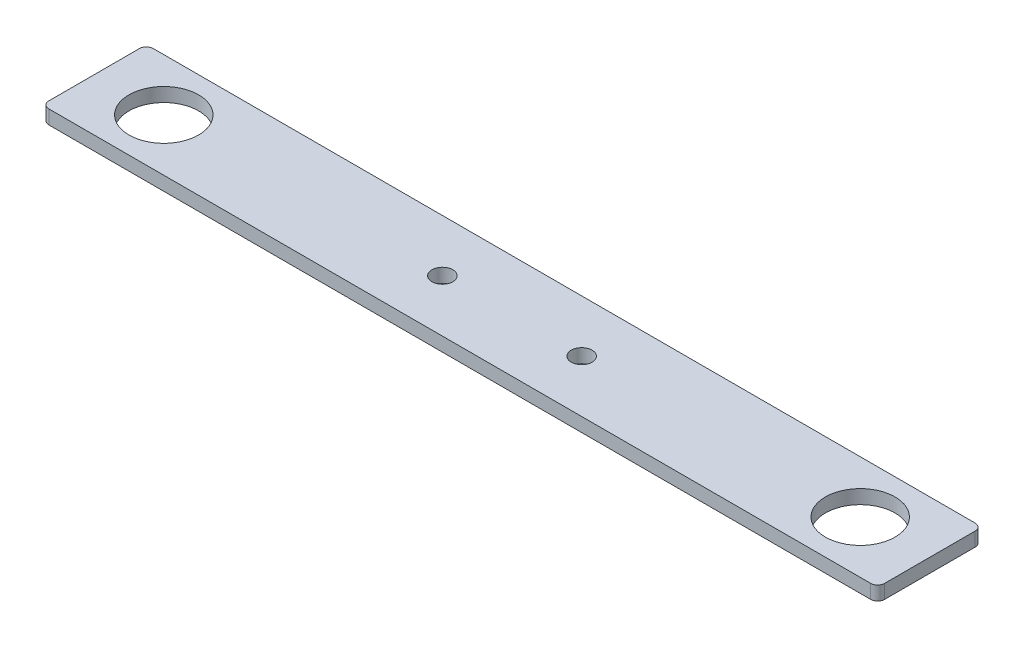
ISO-10303-21;
HEADER;
FILE_DESCRIPTION(('STEP AP214'),'2;1');
FILE_NAME('part.step','',(''),(''),'','','');
FILE_SCHEMA(('AUTOMOTIVE_DESIGN { 1 0 10303 214 1 1 1 1 }'));
ENDSEC;
DATA;
#1=APPLICATION_CONTEXT('core data for automotive mechanical design processes');
#2=APPLICATION_PROTOCOL_DEFINITION('international standard','automotive_design',2000,#1);
#3=PRODUCT_CONTEXT('',#1,'mechanical');
#4=PRODUCT('Part','Part','',(#3));
#5=PRODUCT_RELATED_PRODUCT_CATEGORY('part','',(#4));
#6=PRODUCT_DEFINITION_FORMATION('','',#4);
#7=PRODUCT_DEFINITION_CONTEXT('part definition',#1,'design');
#8=PRODUCT_DEFINITION('design','',#6,#7);
#9=PRODUCT_DEFINITION_SHAPE('','',#8);
#10=(LENGTH_UNIT() NAMED_UNIT(*) SI_UNIT(.MILLI.,.METRE.));
#11=(NAMED_UNIT(*) PLANE_ANGLE_UNIT() SI_UNIT($,.RADIAN.));
#12=(NAMED_UNIT(*) SI_UNIT($,.STERADIAN.) SOLID_ANGLE_UNIT());
#13=UNCERTAINTY_MEASURE_WITH_UNIT(LENGTH_MEASURE(1.E-05),#10,'distance_accuracy_value','');
#14=(GEOMETRIC_REPRESENTATION_CONTEXT(3) GLOBAL_UNCERTAINTY_ASSIGNED_CONTEXT((#13)) GLOBAL_UNIT_ASSIGNED_CONTEXT((#10,
#11,#12)) REPRESENTATION_CONTEXT('',''));
#15=CARTESIAN_POINT('',(0.,0.,0.));
#16=DIRECTION('',(0.,0.,1.));
#17=DIRECTION('',(1.,0.,0.));
#18=AXIS2_PLACEMENT_3D('',#15,#16,#17);
#19=CARTESIAN_POINT('',(120.,2.,0.));
#20=DIRECTION('',(-1.,0.,0.));
#21=DIRECTION('',(0.,0.,1.));
#22=AXIS2_PLACEMENT_3D('',#19,#20,#21);
#23=PLANE('',#22);
#24=DIRECTION('',(0.,0.,-1.));
#25=VECTOR('',#24,1.);
#26=CARTESIAN_POINT('',(120.,0.,0.));
#27=LINE('',#26,#25);
#28=CARTESIAN_POINT('',(120.,0.,-1.));
#29=VERTEX_POINT('',#28);
#30=CARTESIAN_POINT('',(120.,0.,-14.));
#31=VERTEX_POINT('',#30);
#32=EDGE_CURVE('E123',#29,#31,#27,.T.);
#33=ORIENTED_EDGE('',*,*,#32,.T.);
#34=DIRECTION('',(0.,-1.,0.));
#35=VECTOR('',#34,1.);
#36=CARTESIAN_POINT('',(120.,2.,-14.));
#37=LINE('',#36,#35);
#38=CARTESIAN_POINT('',(120.,2.,-14.));
#39=VERTEX_POINT('',#38);
#40=EDGE_CURVE('E145',#31,#39,#37,.F.);
#41=ORIENTED_EDGE('',*,*,#40,.T.);
#42=DIRECTION('',(0.,0.,-1.));
#43=VECTOR('',#42,1.);
#44=CARTESIAN_POINT('',(120.,2.,0.));
#45=LINE('',#44,#43);
#46=CARTESIAN_POINT('',(120.,2.,-1.));
#47=VERTEX_POINT('',#46);
#48=EDGE_CURVE('E189',#47,#39,#45,.T.);
#49=ORIENTED_EDGE('',*,*,#48,.F.);
#50=DIRECTION('',(0.,-1.,0.));
#51=VECTOR('',#50,1.);
#52=CARTESIAN_POINT('',(120.,2.,-1.));
#53=LINE('',#52,#51);
#54=EDGE_CURVE('E142',#47,#29,#53,.T.);
#55=ORIENTED_EDGE('',*,*,#54,.T.);
#56=EDGE_LOOP('',(#33,#41,#49,#55));
#57=FACE_BOUND('',#56,.T.);
#58=ADVANCED_FACE('F35',(#57),#23,.F.);
#59=CARTESIAN_POINT('',(0.,2.,-15.));
#60=DIRECTION('',(0.,0.,-1.));
#61=DIRECTION('',(-1.,0.,0.));
#62=AXIS2_PLACEMENT_3D('',#59,#60,#61);
#63=PLANE('',#62);
#64=DIRECTION('',(1.,0.,0.));
#65=VECTOR('',#64,1.);
#66=CARTESIAN_POINT('',(0.,2.,-15.));
#67=LINE('',#66,#65);
#68=CARTESIAN_POINT('',(1.,2.,-15.));
#69=VERTEX_POINT('',#68);
#70=CARTESIAN_POINT('',(119.,2.,-15.));
#71=VERTEX_POINT('',#70);
#72=EDGE_CURVE('E165',#69,#71,#67,.T.);
#73=ORIENTED_EDGE('',*,*,#72,.T.);
#74=DIRECTION('',(0.,-1.,0.));
#75=VECTOR('',#74,1.);
#76=CARTESIAN_POINT('',(119.,0.,-15.));
#77=LINE('',#76,#75);
#78=CARTESIAN_POINT('',(119.,0.,-15.));
#79=VERTEX_POINT('',#78);
#80=EDGE_CURVE('E122',#71,#79,#77,.T.);
#81=ORIENTED_EDGE('',*,*,#80,.T.);
#82=DIRECTION('',(1.,0.,0.));
#83=VECTOR('',#82,1.);
#84=CARTESIAN_POINT('',(0.,0.,-15.));
#85=LINE('',#84,#83);
#86=CARTESIAN_POINT('',(1.,0.,-15.));
#87=VERTEX_POINT('',#86);
#88=EDGE_CURVE('E106',#87,#79,#85,.T.);
#89=ORIENTED_EDGE('',*,*,#88,.F.);
#90=DIRECTION('',(0.,-1.,0.));
#91=VECTOR('',#90,1.);
#92=CARTESIAN_POINT('',(1.,2.,-15.));
#93=LINE('',#92,#91);
#94=EDGE_CURVE('E119',#87,#69,#93,.F.);
#95=ORIENTED_EDGE('',*,*,#94,.T.);
#96=EDGE_LOOP('',(#73,#81,#89,#95));
#97=FACE_BOUND('',#96,.T.);
#98=ADVANCED_FACE('F118',(#97),#63,.T.);
#99=CARTESIAN_POINT('',(0.,2.,0.));
#100=DIRECTION('',(-1.,0.,0.));
#101=DIRECTION('',(0.,0.,1.));
#102=AXIS2_PLACEMENT_3D('',#99,#100,#101);
#103=PLANE('',#102);
#104=DIRECTION('',(0.,0.,-1.));
#105=VECTOR('',#104,1.);
#106=CARTESIAN_POINT('',(0.,2.,0.));
#107=LINE('',#106,#105);
#108=CARTESIAN_POINT('',(0.,2.,-1.));
#109=VERTEX_POINT('',#108);
#110=CARTESIAN_POINT('',(0.,2.,-14.));
#111=VERTEX_POINT('',#110);
#112=EDGE_CURVE('E160',#109,#111,#107,.T.);
#113=ORIENTED_EDGE('',*,*,#112,.T.);
#114=DIRECTION('',(0.,-1.,0.));
#115=VECTOR('',#114,1.);
#116=CARTESIAN_POINT('',(0.,2.,-14.));
#117=LINE('',#116,#115);
#118=CARTESIAN_POINT('',(0.,0.,-14.));
#119=VERTEX_POINT('',#118);
#120=EDGE_CURVE('E11',#111,#119,#117,.T.);
#121=ORIENTED_EDGE('',*,*,#120,.T.);
#122=DIRECTION('',(0.,0.,-1.));
#123=VECTOR('',#122,1.);
#124=CARTESIAN_POINT('',(0.,0.,0.));
#125=LINE('',#124,#123);
#126=CARTESIAN_POINT('',(0.,0.,-1.));
#127=VERTEX_POINT('',#126);
#128=EDGE_CURVE('E108',#127,#119,#125,.T.);
#129=ORIENTED_EDGE('',*,*,#128,.F.);
#130=DIRECTION('',(0.,-1.,0.));
#131=VECTOR('',#130,1.);
#132=CARTESIAN_POINT('',(0.,2.,-1.));
#133=LINE('',#132,#131);
#134=EDGE_CURVE('E43',#127,#109,#133,.F.);
#135=ORIENTED_EDGE('',*,*,#134,.T.);
#136=EDGE_LOOP('',(#113,#121,#129,#135));
#137=FACE_BOUND('',#136,.T.);
#138=ADVANCED_FACE('F159',(#137),#103,.T.);
#139=CARTESIAN_POINT('',(0.,2.,0.));
#140=DIRECTION('',(0.,0.,-1.));
#141=DIRECTION('',(-1.,0.,0.));
#142=AXIS2_PLACEMENT_3D('',#139,#140,#141);
#143=PLANE('',#142);
#144=DIRECTION('',(1.,0.,0.));
#145=VECTOR('',#144,1.);
#146=CARTESIAN_POINT('',(0.,0.,0.));
#147=LINE('',#146,#145);
#148=CARTESIAN_POINT('',(1.,0.,0.));
#149=VERTEX_POINT('',#148);
#150=CARTESIAN_POINT('',(119.,0.,0.));
#151=VERTEX_POINT('',#150);
#152=EDGE_CURVE('E170',#149,#151,#147,.T.);
#153=ORIENTED_EDGE('',*,*,#152,.T.);
#154=DIRECTION('',(0.,-1.,0.));
#155=VECTOR('',#154,1.);
#156=CARTESIAN_POINT('',(119.,2.,0.));
#157=LINE('',#156,#155);
#158=CARTESIAN_POINT('',(119.,2.,0.));
#159=VERTEX_POINT('',#158);
#160=EDGE_CURVE('E50',#151,#159,#157,.F.);
#161=ORIENTED_EDGE('',*,*,#160,.T.);
#162=DIRECTION('',(1.,0.,0.));
#163=VECTOR('',#162,1.);
#164=CARTESIAN_POINT('',(0.,2.,0.));
#165=LINE('',#164,#163);
#166=CARTESIAN_POINT('',(1.,2.,0.));
#167=VERTEX_POINT('',#166);
#168=EDGE_CURVE('E132',#167,#159,#165,.T.);
#169=ORIENTED_EDGE('',*,*,#168,.F.);
#170=DIRECTION('',(0.,-1.,0.));
#171=VECTOR('',#170,1.);
#172=CARTESIAN_POINT('',(1.,0.,0.));
#173=LINE('',#172,#171);
#174=EDGE_CURVE('E153',#167,#149,#173,.T.);
#175=ORIENTED_EDGE('',*,*,#174,.T.);
#176=EDGE_LOOP('',(#153,#161,#169,#175));
#177=FACE_BOUND('',#176,.T.);
#178=ADVANCED_FACE('F169',(#177),#143,.F.);
#179=CARTESIAN_POINT('',(10.,2.,-7.5));
#180=DIRECTION('',(0.,-1.,0.));
#181=DIRECTION('',(0.,0.,-1.));
#182=AXIS2_PLACEMENT_3D('',#179,#180,#181);
#183=CYLINDRICAL_SURFACE('',#182,5.);
#184=CARTESIAN_POINT('',(10.,2.,-7.5));
#185=DIRECTION('',(0.,1.,0.));
#186=DIRECTION('',(0.,0.,1.));
#187=AXIS2_PLACEMENT_3D('',#184,#185,#186);
#188=CIRCLE('',#187,5.);
#189=CARTESIAN_POINT('',(10.,2.,-2.5));
#190=VERTEX_POINT('',#189);
#191=EDGE_CURVE('E191',#190,#190,#188,.T.);
#192=ORIENTED_EDGE('',*,*,#191,.T.);
#193=EDGE_LOOP('',(#192));
#194=FACE_BOUND('',#193,.T.);
#195=CARTESIAN_POINT('',(10.,0.,-7.5));
#196=DIRECTION('',(0.,1.,0.));
#197=DIRECTION('',(0.,0.,1.));
#198=AXIS2_PLACEMENT_3D('',#195,#196,#197);
#199=CIRCLE('',#198,5.);
#200=CARTESIAN_POINT('',(10.,0.,-2.5));
#201=VERTEX_POINT('',#200);
#202=EDGE_CURVE('E178',#201,#201,#199,.T.);
#203=ORIENTED_EDGE('',*,*,#202,.F.);
#204=EDGE_LOOP('',(#203));
#205=FACE_BOUND('',#204,.T.);
#206=ADVANCED_FACE('F211',(#194,#205),#183,.F.);
#207=CARTESIAN_POINT('',(50.,2.,-7.5));
#208=DIRECTION('',(0.,-1.,0.));
#209=DIRECTION('',(0.,0.,-1.));
#210=AXIS2_PLACEMENT_3D('',#207,#208,#209);
#211=CYLINDRICAL_SURFACE('',#210,1.5);
#212=CARTESIAN_POINT('',(50.,2.,-7.5));
#213=DIRECTION('',(0.,1.,0.));
#214=DIRECTION('',(0.,0.,1.));
#215=AXIS2_PLACEMENT_3D('',#212,#213,#214);
#216=CIRCLE('',#215,1.5);
#217=CARTESIAN_POINT('',(50.,2.,-6.));
#218=VERTEX_POINT('',#217);
#219=EDGE_CURVE('E194',#218,#218,#216,.T.);
#220=ORIENTED_EDGE('',*,*,#219,.T.);
#221=EDGE_LOOP('',(#220));
#222=FACE_BOUND('',#221,.T.);
#223=CARTESIAN_POINT('',(50.,0.,-7.5));
#224=DIRECTION('',(0.,1.,0.));
#225=DIRECTION('',(0.,0.,1.));
#226=AXIS2_PLACEMENT_3D('',#223,#224,#225);
#227=CIRCLE('',#226,1.5);
#228=CARTESIAN_POINT('',(50.,0.,-6.));
#229=VERTEX_POINT('',#228);
#230=EDGE_CURVE('E181',#229,#229,#227,.T.);
#231=ORIENTED_EDGE('',*,*,#230,.F.);
#232=EDGE_LOOP('',(#231));
#233=FACE_BOUND('',#232,.T.);
#234=ADVANCED_FACE('F214',(#222,#233),#211,.F.);
#235=CARTESIAN_POINT('',(70.,2.,-7.5));
#236=DIRECTION('',(0.,-1.,0.));
#237=DIRECTION('',(0.,0.,-1.));
#238=AXIS2_PLACEMENT_3D('',#235,#236,#237);
#239=CYLINDRICAL_SURFACE('',#238,1.5);
#240=CARTESIAN_POINT('',(70.,2.,-7.5));
#241=DIRECTION('',(0.,1.,0.));
#242=DIRECTION('',(0.,0.,1.));
#243=AXIS2_PLACEMENT_3D('',#240,#241,#242);
#244=CIRCLE('',#243,1.5);
#245=CARTESIAN_POINT('',(70.,2.,-6.));
#246=VERTEX_POINT('',#245);
#247=EDGE_CURVE('E173',#246,#246,#244,.T.);
#248=ORIENTED_EDGE('',*,*,#247,.T.);
#249=EDGE_LOOP('',(#248));
#250=FACE_BOUND('',#249,.T.);
#251=CARTESIAN_POINT('',(70.,0.,-7.5));
#252=DIRECTION('',(0.,1.,0.));
#253=DIRECTION('',(0.,0.,1.));
#254=AXIS2_PLACEMENT_3D('',#251,#252,#253);
#255=CIRCLE('',#254,1.5);
#256=CARTESIAN_POINT('',(70.,0.,-6.));
#257=VERTEX_POINT('',#256);
#258=EDGE_CURVE('E184',#257,#257,#255,.T.);
#259=ORIENTED_EDGE('',*,*,#258,.F.);
#260=EDGE_LOOP('',(#259));
#261=FACE_BOUND('',#260,.T.);
#262=ADVANCED_FACE('F200',(#250,#261),#239,.F.);
#263=CARTESIAN_POINT('',(110.,2.,-7.5));
#264=DIRECTION('',(0.,-1.,0.));
#265=DIRECTION('',(0.,0.,-1.));
#266=AXIS2_PLACEMENT_3D('',#263,#264,#265);
#267=CYLINDRICAL_SURFACE('',#266,5.);
#268=CARTESIAN_POINT('',(110.,2.,-7.5));
#269=DIRECTION('',(0.,1.,0.));
#270=DIRECTION('',(0.,0.,1.));
#271=AXIS2_PLACEMENT_3D('',#268,#269,#270);
#272=CIRCLE('',#271,5.);
#273=CARTESIAN_POINT('',(110.,2.,-2.5));
#274=VERTEX_POINT('',#273);
#275=EDGE_CURVE('E128',#274,#274,#272,.T.);
#276=ORIENTED_EDGE('',*,*,#275,.T.);
#277=EDGE_LOOP('',(#276));
#278=FACE_BOUND('',#277,.T.);
#279=CARTESIAN_POINT('',(110.,0.,-7.5));
#280=DIRECTION('',(0.,1.,0.));
#281=DIRECTION('',(0.,0.,1.));
#282=AXIS2_PLACEMENT_3D('',#279,#280,#281);
#283=CIRCLE('',#282,5.);
#284=CARTESIAN_POINT('',(110.,0.,-2.5));
#285=VERTEX_POINT('',#284);
#286=EDGE_CURVE('E135',#285,#285,#283,.T.);
#287=ORIENTED_EDGE('',*,*,#286,.F.);
#288=EDGE_LOOP('',(#287));
#289=FACE_BOUND('',#288,.T.);
#290=ADVANCED_FACE('F205',(#278,#289),#267,.F.);
#291=CARTESIAN_POINT('',(0.,2.,0.));
#292=DIRECTION('',(0.,1.,0.));
#293=DIRECTION('',(0.,0.,1.));
#294=AXIS2_PLACEMENT_3D('',#291,#292,#293);
#295=PLANE('',#294);
#296=ORIENTED_EDGE('',*,*,#247,.F.);
#297=EDGE_LOOP('',(#296));
#298=FACE_BOUND('',#297,.T.);
#299=ORIENTED_EDGE('',*,*,#219,.F.);
#300=EDGE_LOOP('',(#299));
#301=FACE_BOUND('',#300,.T.);
#302=ORIENTED_EDGE('',*,*,#191,.F.);
#303=EDGE_LOOP('',(#302));
#304=FACE_BOUND('',#303,.T.);
#305=ORIENTED_EDGE('',*,*,#48,.T.);
#306=CARTESIAN_POINT('',(119.,2.,-14.));
#307=DIRECTION('',(0.,1.,0.));
#308=DIRECTION('',(0.,0.,1.));
#309=AXIS2_PLACEMENT_3D('',#306,#307,#308);
#310=CIRCLE('',#309,1.);
#311=EDGE_CURVE('E151',#39,#71,#310,.T.);
#312=ORIENTED_EDGE('',*,*,#311,.T.);
#313=ORIENTED_EDGE('',*,*,#72,.F.);
#314=CARTESIAN_POINT('',(1.,2.,-14.));
#315=DIRECTION('',(0.,1.,0.));
#316=DIRECTION('',(0.,0.,1.));
#317=AXIS2_PLACEMENT_3D('',#314,#315,#316);
#318=CIRCLE('',#317,1.);
#319=EDGE_CURVE('E127',#69,#111,#318,.T.);
#320=ORIENTED_EDGE('',*,*,#319,.T.);
#321=ORIENTED_EDGE('',*,*,#112,.F.);
#322=CARTESIAN_POINT('',(1.,2.,-1.));
#323=DIRECTION('',(0.,1.,0.));
#324=DIRECTION('',(0.,0.,1.));
#325=AXIS2_PLACEMENT_3D('',#322,#323,#324);
#326=CIRCLE('',#325,1.);
#327=EDGE_CURVE('E57',#109,#167,#326,.T.);
#328=ORIENTED_EDGE('',*,*,#327,.T.);
#329=ORIENTED_EDGE('',*,*,#168,.T.);
#330=CARTESIAN_POINT('',(119.,2.,-1.));
#331=DIRECTION('',(0.,1.,0.));
#332=DIRECTION('',(0.,0.,1.));
#333=AXIS2_PLACEMENT_3D('',#330,#331,#332);
#334=CIRCLE('',#333,1.);
#335=EDGE_CURVE('E149',#159,#47,#334,.T.);
#336=ORIENTED_EDGE('',*,*,#335,.T.);
#337=EDGE_LOOP('',(#305,#312,#313,#320,#321,#328,#329,#336));
#338=FACE_BOUND('',#337,.T.);
#339=ORIENTED_EDGE('',*,*,#275,.F.);
#340=EDGE_LOOP('',(#339));
#341=FACE_BOUND('',#340,.T.);
#342=ADVANCED_FACE('F163',(#298,#301,#304,#338,#341),#295,.T.);
#343=CARTESIAN_POINT('',(0.,0.,0.));
#344=DIRECTION('',(0.,1.,0.));
#345=DIRECTION('',(0.,0.,1.));
#346=AXIS2_PLACEMENT_3D('',#343,#344,#345);
#347=PLANE('',#346);
#348=ORIENTED_EDGE('',*,*,#258,.T.);
#349=EDGE_LOOP('',(#348));
#350=FACE_BOUND('',#349,.T.);
#351=ORIENTED_EDGE('',*,*,#230,.T.);
#352=EDGE_LOOP('',(#351));
#353=FACE_BOUND('',#352,.T.);
#354=ORIENTED_EDGE('',*,*,#202,.T.);
#355=EDGE_LOOP('',(#354));
#356=FACE_BOUND('',#355,.T.);
#357=ORIENTED_EDGE('',*,*,#88,.T.);
#358=CARTESIAN_POINT('',(119.,0.,-14.));
#359=DIRECTION('',(0.,1.,0.));
#360=DIRECTION('',(0.,0.,1.));
#361=AXIS2_PLACEMENT_3D('',#358,#359,#360);
#362=CIRCLE('',#361,1.);
#363=EDGE_CURVE('E140',#79,#31,#362,.F.);
#364=ORIENTED_EDGE('',*,*,#363,.T.);
#365=ORIENTED_EDGE('',*,*,#32,.F.);
#366=CARTESIAN_POINT('',(119.,0.,-1.));
#367=DIRECTION('',(0.,1.,0.));
#368=DIRECTION('',(0.,0.,1.));
#369=AXIS2_PLACEMENT_3D('',#366,#367,#368);
#370=CIRCLE('',#369,1.);
#371=EDGE_CURVE('E112',#29,#151,#370,.F.);
#372=ORIENTED_EDGE('',*,*,#371,.T.);
#373=ORIENTED_EDGE('',*,*,#152,.F.);
#374=CARTESIAN_POINT('',(1.,0.,-1.));
#375=DIRECTION('',(0.,1.,0.));
#376=DIRECTION('',(0.,0.,1.));
#377=AXIS2_PLACEMENT_3D('',#374,#375,#376);
#378=CIRCLE('',#377,1.);
#379=EDGE_CURVE('E113',#149,#127,#378,.F.);
#380=ORIENTED_EDGE('',*,*,#379,.T.);
#381=ORIENTED_EDGE('',*,*,#128,.T.);
#382=CARTESIAN_POINT('',(1.,0.,-14.));
#383=DIRECTION('',(0.,1.,0.));
#384=DIRECTION('',(0.,0.,1.));
#385=AXIS2_PLACEMENT_3D('',#382,#383,#384);
#386=CIRCLE('',#385,1.);
#387=EDGE_CURVE('E102',#119,#87,#386,.F.);
#388=ORIENTED_EDGE('',*,*,#387,.T.);
#389=EDGE_LOOP('',(#357,#364,#365,#372,#373,#380,#381,#388));
#390=FACE_BOUND('',#389,.T.);
#391=ORIENTED_EDGE('',*,*,#286,.T.);
#392=EDGE_LOOP('',(#391));
#393=FACE_BOUND('',#392,.T.);
#394=ADVANCED_FACE('F104',(#350,#353,#356,#390,#393),#347,.F.);
#395=CARTESIAN_POINT('',(119.,2.,-14.));
#396=DIRECTION('',(0.,1.,0.));
#397=DIRECTION('',(0.,0.,1.));
#398=AXIS2_PLACEMENT_3D('',#395,#396,#397);
#399=CYLINDRICAL_SURFACE('',#398,1.);
#400=ORIENTED_EDGE('',*,*,#311,.F.);
#401=ORIENTED_EDGE('',*,*,#40,.F.);
#402=ORIENTED_EDGE('',*,*,#363,.F.);
#403=ORIENTED_EDGE('',*,*,#80,.F.);
#404=EDGE_LOOP('',(#400,#401,#402,#403));
#405=FACE_BOUND('',#404,.T.);
#406=ADVANCED_FACE('F219',(#405),#399,.T.);
#407=CARTESIAN_POINT('',(119.,2.,-1.));
#408=DIRECTION('',(0.,-1.,0.));
#409=DIRECTION('',(0.,0.,-1.));
#410=AXIS2_PLACEMENT_3D('',#407,#408,#409);
#411=CYLINDRICAL_SURFACE('',#410,1.);
#412=ORIENTED_EDGE('',*,*,#335,.F.);
#413=ORIENTED_EDGE('',*,*,#160,.F.);
#414=ORIENTED_EDGE('',*,*,#371,.F.);
#415=ORIENTED_EDGE('',*,*,#54,.F.);
#416=EDGE_LOOP('',(#412,#413,#414,#415));
#417=FACE_BOUND('',#416,.T.);
#418=ADVANCED_FACE('F226',(#417),#411,.T.);
#419=CARTESIAN_POINT('',(1.,2.,-14.));
#420=DIRECTION('',(0.,-1.,0.));
#421=DIRECTION('',(0.,0.,-1.));
#422=AXIS2_PLACEMENT_3D('',#419,#420,#421);
#423=CYLINDRICAL_SURFACE('',#422,1.);
#424=ORIENTED_EDGE('',*,*,#319,.F.);
#425=ORIENTED_EDGE('',*,*,#94,.F.);
#426=ORIENTED_EDGE('',*,*,#387,.F.);
#427=ORIENTED_EDGE('',*,*,#120,.F.);
#428=EDGE_LOOP('',(#424,#425,#426,#427));
#429=FACE_BOUND('',#428,.T.);
#430=ADVANCED_FACE('F126',(#429),#423,.T.);
#431=CARTESIAN_POINT('',(1.,2.,-1.));
#432=DIRECTION('',(0.,1.,0.));
#433=DIRECTION('',(0.,0.,1.));
#434=AXIS2_PLACEMENT_3D('',#431,#432,#433);
#435=CYLINDRICAL_SURFACE('',#434,1.);
#436=ORIENTED_EDGE('',*,*,#327,.F.);
#437=ORIENTED_EDGE('',*,*,#134,.F.);
#438=ORIENTED_EDGE('',*,*,#379,.F.);
#439=ORIENTED_EDGE('',*,*,#174,.F.);
#440=EDGE_LOOP('',(#436,#437,#438,#439));
#441=FACE_BOUND('',#440,.T.);
#442=ADVANCED_FACE('F37',(#441),#435,.T.);
#443=CLOSED_SHELL('',(#58,#98,#138,#178,#206,#234,#262,#290,#342,#394,#406,#418,#430,#442));
#444=MANIFOLD_SOLID_BREP('B2',#443);
#445=ADVANCED_BREP_SHAPE_REPRESENTATION('',(#18,#444),#14);
#446=SHAPE_DEFINITION_REPRESENTATION(#9,#445);
ENDSEC;
END-ISO-10303-21;
